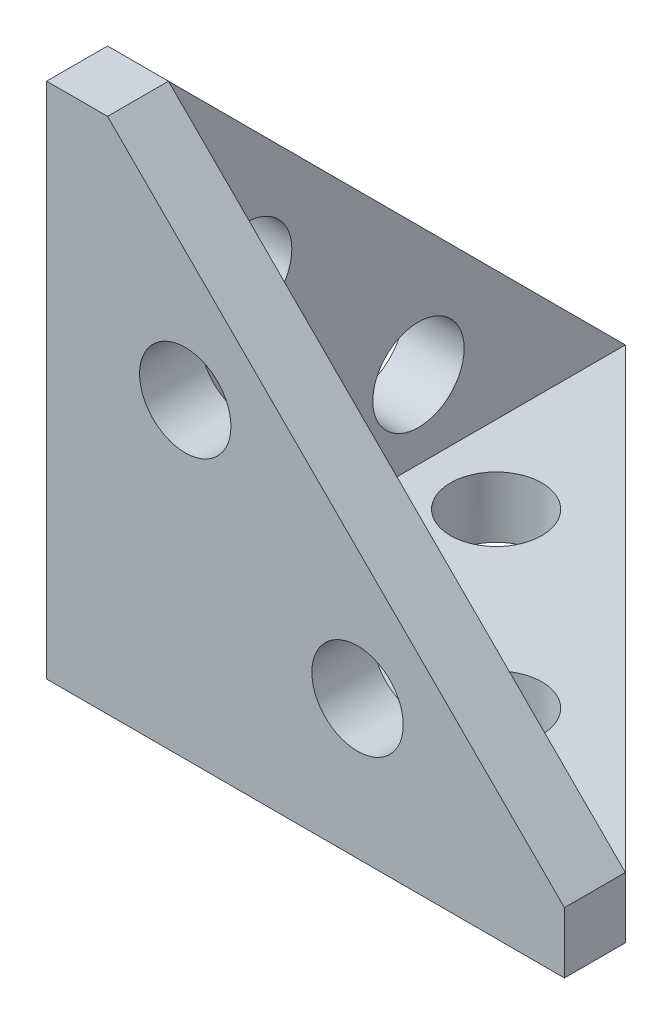
ISO-10303-21;
HEADER;
FILE_DESCRIPTION(('STEP AP214'),'2;1');
FILE_NAME('part.step','',(''),(''),'','','');
FILE_SCHEMA(('AUTOMOTIVE_DESIGN { 1 0 10303 214 1 1 1 1 }'));
ENDSEC;
DATA;
#1=APPLICATION_CONTEXT('core data for automotive mechanical design processes');
#2=APPLICATION_PROTOCOL_DEFINITION('international standard','automotive_design',2000,#1);
#3=PRODUCT_CONTEXT('',#1,'mechanical');
#4=PRODUCT('Part','Part','',(#3));
#5=PRODUCT_RELATED_PRODUCT_CATEGORY('part','',(#4));
#6=PRODUCT_DEFINITION_FORMATION('','',#4);
#7=PRODUCT_DEFINITION_CONTEXT('part definition',#1,'design');
#8=PRODUCT_DEFINITION('design','',#6,#7);
#9=PRODUCT_DEFINITION_SHAPE('','',#8);
#10=(LENGTH_UNIT() NAMED_UNIT(*) SI_UNIT(.MILLI.,.METRE.));
#11=(NAMED_UNIT(*) PLANE_ANGLE_UNIT() SI_UNIT($,.RADIAN.));
#12=(NAMED_UNIT(*) SI_UNIT($,.STERADIAN.) SOLID_ANGLE_UNIT());
#13=UNCERTAINTY_MEASURE_WITH_UNIT(LENGTH_MEASURE(1.E-05),#10,'distance_accuracy_value','');
#14=(GEOMETRIC_REPRESENTATION_CONTEXT(3) GLOBAL_UNCERTAINTY_ASSIGNED_CONTEXT((#13)) GLOBAL_UNIT_ASSIGNED_CONTEXT((#10,
#11,#12)) REPRESENTATION_CONTEXT('',''));
#15=CARTESIAN_POINT('',(0.,0.,0.));
#16=DIRECTION('',(0.,0.,1.));
#17=DIRECTION('',(1.,0.,0.));
#18=AXIS2_PLACEMENT_3D('',#15,#16,#17);
#19=CARTESIAN_POINT('',(0.,2.,-15.));
#20=DIRECTION('',(-0.707106781186547,0.,0.707106781186547));
#21=DIRECTION('',(0.707106781186548,0.,0.707106781186548));
#22=AXIS2_PLACEMENT_3D('',#19,#20,#21);
#23=PLANE('',#22);
#24=DIRECTION('',(-0.707106781186547,0.,-0.707106781186547));
#25=VECTOR('',#24,1.);
#26=CARTESIAN_POINT('',(0.,0.,-15.));
#27=LINE('',#26,#25);
#28=CARTESIAN_POINT('',(15.,0.,0.));
#29=VERTEX_POINT('',#28);
#30=CARTESIAN_POINT('',(0.,0.,-15.));
#31=VERTEX_POINT('',#30);
#32=EDGE_CURVE('E191',#29,#31,#27,.T.);
#33=ORIENTED_EDGE('',*,*,#32,.T.);
#34=DIRECTION('',(0.,-1.,0.));
#35=VECTOR('',#34,1.);
#36=CARTESIAN_POINT('',(0.,2.,-15.));
#37=LINE('',#36,#35);
#38=CARTESIAN_POINT('',(0.,2.,-15.));
#39=VERTEX_POINT('',#38);
#40=EDGE_CURVE('E122',#39,#31,#37,.T.);
#41=ORIENTED_EDGE('',*,*,#40,.F.);
#42=DIRECTION('',(-0.707106781186547,0.,-0.707106781186547));
#43=VECTOR('',#42,1.);
#44=CARTESIAN_POINT('',(0.,2.,-15.));
#45=LINE('',#44,#43);
#46=CARTESIAN_POINT('',(15.,2.,0.));
#47=VERTEX_POINT('',#46);
#48=EDGE_CURVE('E114',#47,#39,#45,.T.);
#49=ORIENTED_EDGE('',*,*,#48,.F.);
#50=DIRECTION('',(0.,-1.,0.));
#51=VECTOR('',#50,1.);
#52=CARTESIAN_POINT('',(15.,2.,0.));
#53=LINE('',#52,#51);
#54=EDGE_CURVE('E119',#47,#29,#53,.T.);
#55=ORIENTED_EDGE('',*,*,#54,.T.);
#56=EDGE_LOOP('',(#33,#41,#49,#55));
#57=FACE_BOUND('',#56,.T.);
#58=ADVANCED_FACE('F32',(#57),#23,.F.);
#59=CARTESIAN_POINT('',(0.,2.,0.));
#60=DIRECTION('',(0.,-1.,0.));
#61=DIRECTION('',(0.,0.,-1.));
#62=AXIS2_PLACEMENT_3D('',#59,#60,#61);
#63=PLANE('',#62);
#64=CARTESIAN_POINT('',(8.20710678118655,2.,-2.55025253169417));
#65=DIRECTION('',(0.,1.,0.));
#66=DIRECTION('',(0.,0.,1.));
#67=AXIS2_PLACEMENT_3D('',#64,#65,#66);
#68=CIRCLE('',#67,1.5);
#69=CARTESIAN_POINT('',(8.20710678118655,2.,-1.05025253169417));
#70=VERTEX_POINT('',#69);
#71=EDGE_CURVE('E158',#70,#70,#68,.T.);
#72=ORIENTED_EDGE('',*,*,#71,.F.);
#73=EDGE_LOOP('',(#72));
#74=FACE_BOUND('',#73,.T.);
#75=CARTESIAN_POINT('',(2.55025253169417,2.,-8.20710678118655));
#76=DIRECTION('',(0.,1.,0.));
#77=DIRECTION('',(0.,0.,1.));
#78=AXIS2_PLACEMENT_3D('',#75,#76,#77);
#79=CIRCLE('',#78,1.5);
#80=CARTESIAN_POINT('',(2.55025253169417,2.,-6.70710678118655));
#81=VERTEX_POINT('',#80);
#82=EDGE_CURVE('E148',#81,#81,#79,.T.);
#83=ORIENTED_EDGE('',*,*,#82,.F.);
#84=EDGE_LOOP('',(#83));
#85=FACE_BOUND('',#84,.T.);
#86=DIRECTION('',(0.,0.,1.));
#87=VECTOR('',#86,1.);
#88=CARTESIAN_POINT('',(0.,2.,0.));
#89=LINE('',#88,#87);
#90=CARTESIAN_POINT('',(0.,2.,0.));
#91=VERTEX_POINT('',#90);
#92=EDGE_CURVE('E57',#39,#91,#89,.T.);
#93=ORIENTED_EDGE('',*,*,#92,.T.);
#94=DIRECTION('',(1.,0.,0.));
#95=VECTOR('',#94,1.);
#96=CARTESIAN_POINT('',(0.,2.,0.));
#97=LINE('',#96,#95);
#98=EDGE_CURVE('E107',#91,#47,#97,.T.);
#99=ORIENTED_EDGE('',*,*,#98,.T.);
#100=ORIENTED_EDGE('',*,*,#48,.T.);
#101=EDGE_LOOP('',(#93,#99,#100));
#102=FACE_BOUND('',#101,.T.);
#103=ADVANCED_FACE('F113',(#74,#85,#102),#63,.F.);
#104=CARTESIAN_POINT('',(0.,0.,0.));
#105=DIRECTION('',(0.,-1.,0.));
#106=DIRECTION('',(0.,0.,-1.));
#107=AXIS2_PLACEMENT_3D('',#104,#105,#106);
#108=PLANE('',#107);
#109=CARTESIAN_POINT('',(8.20710678118655,0.,-2.55025253169417));
#110=DIRECTION('',(0.,-1.,0.));
#111=DIRECTION('',(0.,0.,-1.));
#112=AXIS2_PLACEMENT_3D('',#109,#110,#111);
#113=CIRCLE('',#112,1.5);
#114=CARTESIAN_POINT('',(8.20710678118655,0.,-4.05025253169417));
#115=VERTEX_POINT('',#114);
#116=EDGE_CURVE('E35',#115,#115,#113,.T.);
#117=ORIENTED_EDGE('',*,*,#116,.F.);
#118=EDGE_LOOP('',(#117));
#119=FACE_BOUND('',#118,.T.);
#120=CARTESIAN_POINT('',(2.55025253169417,0.,-8.20710678118655));
#121=DIRECTION('',(0.,-1.,0.));
#122=DIRECTION('',(0.,0.,-1.));
#123=AXIS2_PLACEMENT_3D('',#120,#121,#122);
#124=CIRCLE('',#123,1.5);
#125=CARTESIAN_POINT('',(2.55025253169417,0.,-9.70710678118655));
#126=VERTEX_POINT('',#125);
#127=EDGE_CURVE('E146',#126,#126,#124,.T.);
#128=ORIENTED_EDGE('',*,*,#127,.F.);
#129=EDGE_LOOP('',(#128));
#130=FACE_BOUND('',#129,.T.);
#131=DIRECTION('',(-1.,0.,0.));
#132=VECTOR('',#131,1.);
#133=CARTESIAN_POINT('',(0.,0.,-15.));
#134=LINE('',#133,#132);
#135=CARTESIAN_POINT('',(-2.,0.,-15.));
#136=VERTEX_POINT('',#135);
#137=EDGE_CURVE('E179',#31,#136,#134,.T.);
#138=ORIENTED_EDGE('',*,*,#137,.F.);
#139=ORIENTED_EDGE('',*,*,#32,.F.);
#140=DIRECTION('',(0.,0.,-1.));
#141=VECTOR('',#140,1.);
#142=CARTESIAN_POINT('',(15.,0.,2.));
#143=LINE('',#142,#141);
#144=CARTESIAN_POINT('',(15.,0.,2.));
#145=VERTEX_POINT('',#144);
#146=EDGE_CURVE('E126',#145,#29,#143,.T.);
#147=ORIENTED_EDGE('',*,*,#146,.F.);
#148=DIRECTION('',(1.,0.,0.));
#149=VECTOR('',#148,1.);
#150=CARTESIAN_POINT('',(-2.,0.,2.));
#151=LINE('',#150,#149);
#152=CARTESIAN_POINT('',(-2.,0.,2.));
#153=VERTEX_POINT('',#152);
#154=EDGE_CURVE('E185',#153,#145,#151,.T.);
#155=ORIENTED_EDGE('',*,*,#154,.F.);
#156=DIRECTION('',(0.,0.,1.));
#157=VECTOR('',#156,1.);
#158=CARTESIAN_POINT('',(-2.,0.,-15.));
#159=LINE('',#158,#157);
#160=EDGE_CURVE('E182',#136,#153,#159,.T.);
#161=ORIENTED_EDGE('',*,*,#160,.F.);
#162=EDGE_LOOP('',(#138,#139,#147,#155,#161));
#163=FACE_BOUND('',#162,.T.);
#164=ADVANCED_FACE('F204',(#119,#130,#163),#108,.T.);
#165=CARTESIAN_POINT('',(0.,0.,-15.));
#166=DIRECTION('',(1.,0.,0.));
#167=DIRECTION('',(0.,0.,-1.));
#168=AXIS2_PLACEMENT_3D('',#165,#166,#167);
#169=PLANE('',#168);
#170=CARTESIAN_POINT('',(0.,4.55025253169417,-8.20710678118655));
#171=DIRECTION('',(1.,0.,0.));
#172=DIRECTION('',(0.,0.,-1.));
#173=AXIS2_PLACEMENT_3D('',#170,#171,#172);
#174=CIRCLE('',#173,1.5);
#175=CARTESIAN_POINT('',(0.,4.55025253169417,-9.70710678118655));
#176=VERTEX_POINT('',#175);
#177=EDGE_CURVE('E138',#176,#176,#174,.T.);
#178=ORIENTED_EDGE('',*,*,#177,.F.);
#179=EDGE_LOOP('',(#178));
#180=FACE_BOUND('',#179,.T.);
#181=CARTESIAN_POINT('',(0.,10.2071067811865,-2.55025253169417));
#182=DIRECTION('',(1.,0.,0.));
#183=DIRECTION('',(0.,0.,-1.));
#184=AXIS2_PLACEMENT_3D('',#181,#182,#183);
#185=CIRCLE('',#184,1.5);
#186=CARTESIAN_POINT('',(0.,10.2071067811865,-4.05025253169417));
#187=VERTEX_POINT('',#186);
#188=EDGE_CURVE('E134',#187,#187,#185,.T.);
#189=ORIENTED_EDGE('',*,*,#188,.F.);
#190=EDGE_LOOP('',(#189));
#191=FACE_BOUND('',#190,.T.);
#192=DIRECTION('',(0.,-0.707106781186547,-0.707106781186547));
#193=VECTOR('',#192,1.);
#194=CARTESIAN_POINT('',(0.,2.,-15.));
#195=LINE('',#194,#193);
#196=CARTESIAN_POINT('',(0.,17.,0.));
#197=VERTEX_POINT('',#196);
#198=EDGE_CURVE('E168',#197,#39,#195,.T.);
#199=ORIENTED_EDGE('',*,*,#198,.F.);
#200=DIRECTION('',(0.,1.,0.));
#201=VECTOR('',#200,1.);
#202=CARTESIAN_POINT('',(0.,0.,0.));
#203=LINE('',#202,#201);
#204=EDGE_CURVE('E109',#91,#197,#203,.T.);
#205=ORIENTED_EDGE('',*,*,#204,.F.);
#206=ORIENTED_EDGE('',*,*,#92,.F.);
#207=EDGE_LOOP('',(#199,#205,#206));
#208=FACE_BOUND('',#207,.T.);
#209=ADVANCED_FACE('F215',(#180,#191,#208),#169,.T.);
#210=CARTESIAN_POINT('',(15.,0.,0.));
#211=DIRECTION('',(0.,0.,-1.));
#212=DIRECTION('',(-1.,0.,0.));
#213=AXIS2_PLACEMENT_3D('',#210,#211,#212);
#214=PLANE('',#213);
#215=CARTESIAN_POINT('',(8.20710678118655,4.55025253169417,0.));
#216=DIRECTION('',(0.,0.,-1.));
#217=DIRECTION('',(-1.,0.,0.));
#218=AXIS2_PLACEMENT_3D('',#215,#216,#217);
#219=CIRCLE('',#218,1.5);
#220=CARTESIAN_POINT('',(6.70710678118655,4.55025253169417,0.));
#221=VERTEX_POINT('',#220);
#222=EDGE_CURVE('E145',#221,#221,#219,.T.);
#223=ORIENTED_EDGE('',*,*,#222,.F.);
#224=EDGE_LOOP('',(#223));
#225=FACE_BOUND('',#224,.T.);
#226=CARTESIAN_POINT('',(2.55025253169417,10.2071067811865,0.));
#227=DIRECTION('',(0.,0.,-1.));
#228=DIRECTION('',(-1.,0.,0.));
#229=AXIS2_PLACEMENT_3D('',#226,#227,#228);
#230=CIRCLE('',#229,1.5);
#231=CARTESIAN_POINT('',(1.05025253169417,10.2071067811865,0.));
#232=VERTEX_POINT('',#231);
#233=EDGE_CURVE('E142',#232,#232,#230,.T.);
#234=ORIENTED_EDGE('',*,*,#233,.F.);
#235=EDGE_LOOP('',(#234));
#236=FACE_BOUND('',#235,.T.);
#237=DIRECTION('',(-0.707106781186547,0.707106781186547,0.));
#238=VECTOR('',#237,1.);
#239=CARTESIAN_POINT('',(0.,17.,0.));
#240=LINE('',#239,#238);
#241=EDGE_CURVE('E97',#47,#197,#240,.T.);
#242=ORIENTED_EDGE('',*,*,#241,.F.);
#243=ORIENTED_EDGE('',*,*,#98,.F.);
#244=ORIENTED_EDGE('',*,*,#204,.T.);
#245=EDGE_LOOP('',(#242,#243,#244));
#246=FACE_BOUND('',#245,.T.);
#247=ADVANCED_FACE('F106',(#225,#236,#246),#214,.T.);
#248=CARTESIAN_POINT('',(15.,0.,2.));
#249=DIRECTION('',(1.,0.,0.));
#250=DIRECTION('',(0.,0.,-1.));
#251=AXIS2_PLACEMENT_3D('',#248,#249,#250);
#252=PLANE('',#251);
#253=DIRECTION('',(0.,0.,-1.));
#254=VECTOR('',#253,1.);
#255=CARTESIAN_POINT('',(15.,2.,15.));
#256=LINE('',#255,#254);
#257=CARTESIAN_POINT('',(15.,2.,2.));
#258=VERTEX_POINT('',#257);
#259=EDGE_CURVE('E94',#258,#47,#256,.T.);
#260=ORIENTED_EDGE('',*,*,#259,.F.);
#261=DIRECTION('',(0.,1.,0.));
#262=VECTOR('',#261,1.);
#263=CARTESIAN_POINT('',(15.,0.,2.));
#264=LINE('',#263,#262);
#265=EDGE_CURVE('E192',#145,#258,#264,.T.);
#266=ORIENTED_EDGE('',*,*,#265,.F.);
#267=ORIENTED_EDGE('',*,*,#146,.T.);
#268=ORIENTED_EDGE('',*,*,#54,.F.);
#269=EDGE_LOOP('',(#260,#266,#267,#268));
#270=FACE_BOUND('',#269,.T.);
#271=ADVANCED_FACE('F124',(#270),#252,.T.);
#272=CARTESIAN_POINT('',(-2.,0.,2.));
#273=DIRECTION('',(0.,0.,1.));
#274=DIRECTION('',(1.,0.,0.));
#275=AXIS2_PLACEMENT_3D('',#272,#273,#274);
#276=PLANE('',#275);
#277=CARTESIAN_POINT('',(8.20710678118655,4.55025253169417,2.));
#278=DIRECTION('',(0.,0.,1.));
#279=DIRECTION('',(1.,0.,0.));
#280=AXIS2_PLACEMENT_3D('',#277,#278,#279);
#281=CIRCLE('',#280,1.5);
#282=CARTESIAN_POINT('',(9.70710678118655,4.55025253169417,2.));
#283=VERTEX_POINT('',#282);
#284=EDGE_CURVE('E143',#283,#283,#281,.T.);
#285=ORIENTED_EDGE('',*,*,#284,.F.);
#286=EDGE_LOOP('',(#285));
#287=FACE_BOUND('',#286,.T.);
#288=CARTESIAN_POINT('',(2.55025253169417,10.2071067811865,2.));
#289=DIRECTION('',(0.,0.,1.));
#290=DIRECTION('',(1.,0.,0.));
#291=AXIS2_PLACEMENT_3D('',#288,#289,#290);
#292=CIRCLE('',#291,1.5);
#293=CARTESIAN_POINT('',(4.05025253169417,10.2071067811865,2.));
#294=VERTEX_POINT('',#293);
#295=EDGE_CURVE('E139',#294,#294,#292,.T.);
#296=ORIENTED_EDGE('',*,*,#295,.F.);
#297=EDGE_LOOP('',(#296));
#298=FACE_BOUND('',#297,.T.);
#299=DIRECTION('',(0.707106781186548,-0.707106781186548,0.));
#300=VECTOR('',#299,1.);
#301=CARTESIAN_POINT('',(7.5,9.5,2.));
#302=LINE('',#301,#300);
#303=CARTESIAN_POINT('',(0.,17.,2.));
#304=VERTEX_POINT('',#303);
#305=EDGE_CURVE('E99',#304,#258,#302,.T.);
#306=ORIENTED_EDGE('',*,*,#305,.F.);
#307=DIRECTION('',(1.,0.,0.));
#308=VECTOR('',#307,1.);
#309=CARTESIAN_POINT('',(-2.,17.,2.));
#310=LINE('',#309,#308);
#311=CARTESIAN_POINT('',(-2.,17.,2.));
#312=VERTEX_POINT('',#311);
#313=EDGE_CURVE('E176',#312,#304,#310,.T.);
#314=ORIENTED_EDGE('',*,*,#313,.F.);
#315=DIRECTION('',(0.,1.,0.));
#316=VECTOR('',#315,1.);
#317=CARTESIAN_POINT('',(-2.,0.,2.));
#318=LINE('',#317,#316);
#319=EDGE_CURVE('E194',#153,#312,#318,.T.);
#320=ORIENTED_EDGE('',*,*,#319,.F.);
#321=ORIENTED_EDGE('',*,*,#154,.T.);
#322=ORIENTED_EDGE('',*,*,#265,.T.);
#323=EDGE_LOOP('',(#306,#314,#320,#321,#322));
#324=FACE_BOUND('',#323,.T.);
#325=ADVANCED_FACE('F275',(#287,#298,#324),#276,.T.);
#326=CARTESIAN_POINT('',(-2.,0.,-15.));
#327=DIRECTION('',(-1.,0.,0.));
#328=DIRECTION('',(0.,0.,1.));
#329=AXIS2_PLACEMENT_3D('',#326,#327,#328);
#330=PLANE('',#329);
#331=CARTESIAN_POINT('',(-2.,4.55025253169417,-8.20710678118655));
#332=DIRECTION('',(-1.,0.,0.));
#333=DIRECTION('',(0.,0.,1.));
#334=AXIS2_PLACEMENT_3D('',#331,#332,#333);
#335=CIRCLE('',#334,1.5);
#336=CARTESIAN_POINT('',(-2.,4.55025253169417,-6.70710678118655));
#337=VERTEX_POINT('',#336);
#338=EDGE_CURVE('E135',#337,#337,#335,.T.);
#339=ORIENTED_EDGE('',*,*,#338,.F.);
#340=EDGE_LOOP('',(#339));
#341=FACE_BOUND('',#340,.T.);
#342=CARTESIAN_POINT('',(-2.,10.2071067811865,-2.55025253169417));
#343=DIRECTION('',(-1.,0.,0.));
#344=DIRECTION('',(0.,0.,1.));
#345=AXIS2_PLACEMENT_3D('',#342,#343,#344);
#346=CIRCLE('',#345,1.5);
#347=CARTESIAN_POINT('',(-2.,10.2071067811865,-1.05025253169417));
#348=VERTEX_POINT('',#347);
#349=EDGE_CURVE('E110',#348,#348,#346,.T.);
#350=ORIENTED_EDGE('',*,*,#349,.F.);
#351=EDGE_LOOP('',(#350));
#352=FACE_BOUND('',#351,.T.);
#353=DIRECTION('',(0.,0.707106781186548,0.707106781186548));
#354=VECTOR('',#353,1.);
#355=CARTESIAN_POINT('',(-2.,1.,-16.));
#356=LINE('',#355,#354);
#357=CARTESIAN_POINT('',(-2.,2.,-15.));
#358=VERTEX_POINT('',#357);
#359=CARTESIAN_POINT('',(-2.,17.,0.));
#360=VERTEX_POINT('',#359);
#361=EDGE_CURVE('E48',#358,#360,#356,.T.);
#362=ORIENTED_EDGE('',*,*,#361,.F.);
#363=DIRECTION('',(0.,1.,0.));
#364=VECTOR('',#363,1.);
#365=CARTESIAN_POINT('',(-2.,0.,-15.));
#366=LINE('',#365,#364);
#367=EDGE_CURVE('E189',#136,#358,#366,.T.);
#368=ORIENTED_EDGE('',*,*,#367,.F.);
#369=ORIENTED_EDGE('',*,*,#160,.T.);
#370=ORIENTED_EDGE('',*,*,#319,.T.);
#371=DIRECTION('',(0.,0.,1.));
#372=VECTOR('',#371,1.);
#373=CARTESIAN_POINT('',(-2.,17.,-15.));
#374=LINE('',#373,#372);
#375=EDGE_CURVE('E174',#360,#312,#374,.T.);
#376=ORIENTED_EDGE('',*,*,#375,.F.);
#377=EDGE_LOOP('',(#362,#368,#369,#370,#376));
#378=FACE_BOUND('',#377,.T.);
#379=ADVANCED_FACE('F207',(#341,#352,#378),#330,.T.);
#380=CARTESIAN_POINT('',(0.,0.,-15.));
#381=DIRECTION('',(0.,0.,-1.));
#382=DIRECTION('',(-1.,0.,0.));
#383=AXIS2_PLACEMENT_3D('',#380,#381,#382);
#384=PLANE('',#383);
#385=DIRECTION('',(1.,0.,0.));
#386=VECTOR('',#385,1.);
#387=CARTESIAN_POINT('',(-15.,2.,-15.));
#388=LINE('',#387,#386);
#389=EDGE_CURVE('E170',#358,#39,#388,.T.);
#390=ORIENTED_EDGE('',*,*,#389,.T.);
#391=ORIENTED_EDGE('',*,*,#40,.T.);
#392=ORIENTED_EDGE('',*,*,#137,.T.);
#393=ORIENTED_EDGE('',*,*,#367,.T.);
#394=EDGE_LOOP('',(#390,#391,#392,#393));
#395=FACE_BOUND('',#394,.T.);
#396=ADVANCED_FACE('F202',(#395),#384,.T.);
#397=CARTESIAN_POINT('',(0.,17.,0.));
#398=DIRECTION('',(0.,-1.,0.));
#399=DIRECTION('',(0.,0.,-1.));
#400=AXIS2_PLACEMENT_3D('',#397,#398,#399);
#401=PLANE('',#400);
#402=ORIENTED_EDGE('',*,*,#313,.T.);
#403=DIRECTION('',(0.,0.,-1.));
#404=VECTOR('',#403,1.);
#405=CARTESIAN_POINT('',(0.,17.,0.));
#406=LINE('',#405,#404);
#407=EDGE_CURVE('E11',#304,#197,#406,.T.);
#408=ORIENTED_EDGE('',*,*,#407,.T.);
#409=DIRECTION('',(-1.,0.,0.));
#410=VECTOR('',#409,1.);
#411=CARTESIAN_POINT('',(0.,17.,0.));
#412=LINE('',#411,#410);
#413=EDGE_CURVE('E40',#197,#360,#412,.T.);
#414=ORIENTED_EDGE('',*,*,#413,.T.);
#415=ORIENTED_EDGE('',*,*,#375,.T.);
#416=EDGE_LOOP('',(#402,#408,#414,#415));
#417=FACE_BOUND('',#416,.T.);
#418=ADVANCED_FACE('F211',(#417),#401,.F.);
#419=CARTESIAN_POINT('',(-15.,2.,-15.));
#420=DIRECTION('',(0.,-0.707106781186547,0.707106781186547));
#421=DIRECTION('',(0.,-0.707106781186548,-0.707106781186548));
#422=AXIS2_PLACEMENT_3D('',#419,#420,#421);
#423=PLANE('',#422);
#424=ORIENTED_EDGE('',*,*,#361,.T.);
#425=ORIENTED_EDGE('',*,*,#413,.F.);
#426=ORIENTED_EDGE('',*,*,#198,.T.);
#427=ORIENTED_EDGE('',*,*,#389,.F.);
#428=EDGE_LOOP('',(#424,#425,#426,#427));
#429=FACE_BOUND('',#428,.T.);
#430=ADVANCED_FACE('F213',(#429),#423,.F.);
#431=CARTESIAN_POINT('',(0.,17.,15.));
#432=DIRECTION('',(-0.707106781186547,-0.707106781186547,0.));
#433=DIRECTION('',(0.707106781186548,-0.707106781186548,0.));
#434=AXIS2_PLACEMENT_3D('',#431,#432,#433);
#435=PLANE('',#434);
#436=ORIENTED_EDGE('',*,*,#305,.T.);
#437=ORIENTED_EDGE('',*,*,#259,.T.);
#438=ORIENTED_EDGE('',*,*,#241,.T.);
#439=ORIENTED_EDGE('',*,*,#407,.F.);
#440=EDGE_LOOP('',(#436,#437,#438,#439));
#441=FACE_BOUND('',#440,.T.);
#442=ADVANCED_FACE('F96',(#441),#435,.F.);
#443=CARTESIAN_POINT('',(-15.,10.2071067811865,-2.55025253169417));
#444=DIRECTION('',(1.,0.,0.));
#445=DIRECTION('',(0.,0.,-1.));
#446=AXIS2_PLACEMENT_3D('',#443,#444,#445);
#447=CYLINDRICAL_SURFACE('',#446,1.5);
#448=ORIENTED_EDGE('',*,*,#349,.T.);
#449=EDGE_LOOP('',(#448));
#450=FACE_BOUND('',#449,.T.);
#451=ORIENTED_EDGE('',*,*,#188,.T.);
#452=EDGE_LOOP('',(#451));
#453=FACE_BOUND('',#452,.T.);
#454=ADVANCED_FACE('F262',(#450,#453),#447,.F.);
#455=CARTESIAN_POINT('',(-15.,4.55025253169417,-8.20710678118655));
#456=DIRECTION('',(1.,0.,0.));
#457=DIRECTION('',(0.,0.,-1.));
#458=AXIS2_PLACEMENT_3D('',#455,#456,#457);
#459=CYLINDRICAL_SURFACE('',#458,1.5);
#460=ORIENTED_EDGE('',*,*,#338,.T.);
#461=EDGE_LOOP('',(#460));
#462=FACE_BOUND('',#461,.T.);
#463=ORIENTED_EDGE('',*,*,#177,.T.);
#464=EDGE_LOOP('',(#463));
#465=FACE_BOUND('',#464,.T.);
#466=ADVANCED_FACE('F258',(#462,#465),#459,.F.);
#467=CARTESIAN_POINT('',(2.55025253169417,10.2071067811865,15.));
#468=DIRECTION('',(0.,0.,-1.));
#469=DIRECTION('',(-1.,0.,0.));
#470=AXIS2_PLACEMENT_3D('',#467,#468,#469);
#471=CYLINDRICAL_SURFACE('',#470,1.5);
#472=ORIENTED_EDGE('',*,*,#295,.T.);
#473=EDGE_LOOP('',(#472));
#474=FACE_BOUND('',#473,.T.);
#475=ORIENTED_EDGE('',*,*,#233,.T.);
#476=EDGE_LOOP('',(#475));
#477=FACE_BOUND('',#476,.T.);
#478=ADVANCED_FACE('F254',(#474,#477),#471,.F.);
#479=CARTESIAN_POINT('',(8.20710678118655,4.55025253169417,15.));
#480=DIRECTION('',(0.,0.,-1.));
#481=DIRECTION('',(-1.,0.,0.));
#482=AXIS2_PLACEMENT_3D('',#479,#480,#481);
#483=CYLINDRICAL_SURFACE('',#482,1.5);
#484=ORIENTED_EDGE('',*,*,#284,.T.);
#485=EDGE_LOOP('',(#484));
#486=FACE_BOUND('',#485,.T.);
#487=ORIENTED_EDGE('',*,*,#222,.T.);
#488=EDGE_LOOP('',(#487));
#489=FACE_BOUND('',#488,.T.);
#490=ADVANCED_FACE('F249',(#486,#489),#483,.F.);
#491=CARTESIAN_POINT('',(2.55025253169417,-13.,-8.20710678118655));
#492=DIRECTION('',(0.,1.,0.));
#493=DIRECTION('',(0.,0.,1.));
#494=AXIS2_PLACEMENT_3D('',#491,#492,#493);
#495=CYLINDRICAL_SURFACE('',#494,1.5);
#496=ORIENTED_EDGE('',*,*,#127,.T.);
#497=EDGE_LOOP('',(#496));
#498=FACE_BOUND('',#497,.T.);
#499=ORIENTED_EDGE('',*,*,#82,.T.);
#500=EDGE_LOOP('',(#499));
#501=FACE_BOUND('',#500,.T.);
#502=ADVANCED_FACE('F243',(#498,#501),#495,.F.);
#503=CARTESIAN_POINT('',(8.20710678118655,-13.,-2.55025253169417));
#504=DIRECTION('',(0.,1.,0.));
#505=DIRECTION('',(0.,0.,1.));
#506=AXIS2_PLACEMENT_3D('',#503,#504,#505);
#507=CYLINDRICAL_SURFACE('',#506,1.5);
#508=ORIENTED_EDGE('',*,*,#116,.T.);
#509=EDGE_LOOP('',(#508));
#510=FACE_BOUND('',#509,.T.);
#511=ORIENTED_EDGE('',*,*,#71,.T.);
#512=EDGE_LOOP('',(#511));
#513=FACE_BOUND('',#512,.T.);
#514=ADVANCED_FACE('F241',(#510,#513),#507,.F.);
#515=CLOSED_SHELL('',(#58,#103,#164,#209,#247,#271,#325,#379,#396,#418,#430,#442,#454,#466,#478,
#490,#502,#514));
#516=MANIFOLD_SOLID_BREP('B2',#515);
#517=ADVANCED_BREP_SHAPE_REPRESENTATION('',(#18,#516),#14);
#518=SHAPE_DEFINITION_REPRESENTATION(#9,#517);
ENDSEC;
END-ISO-10303-21;
